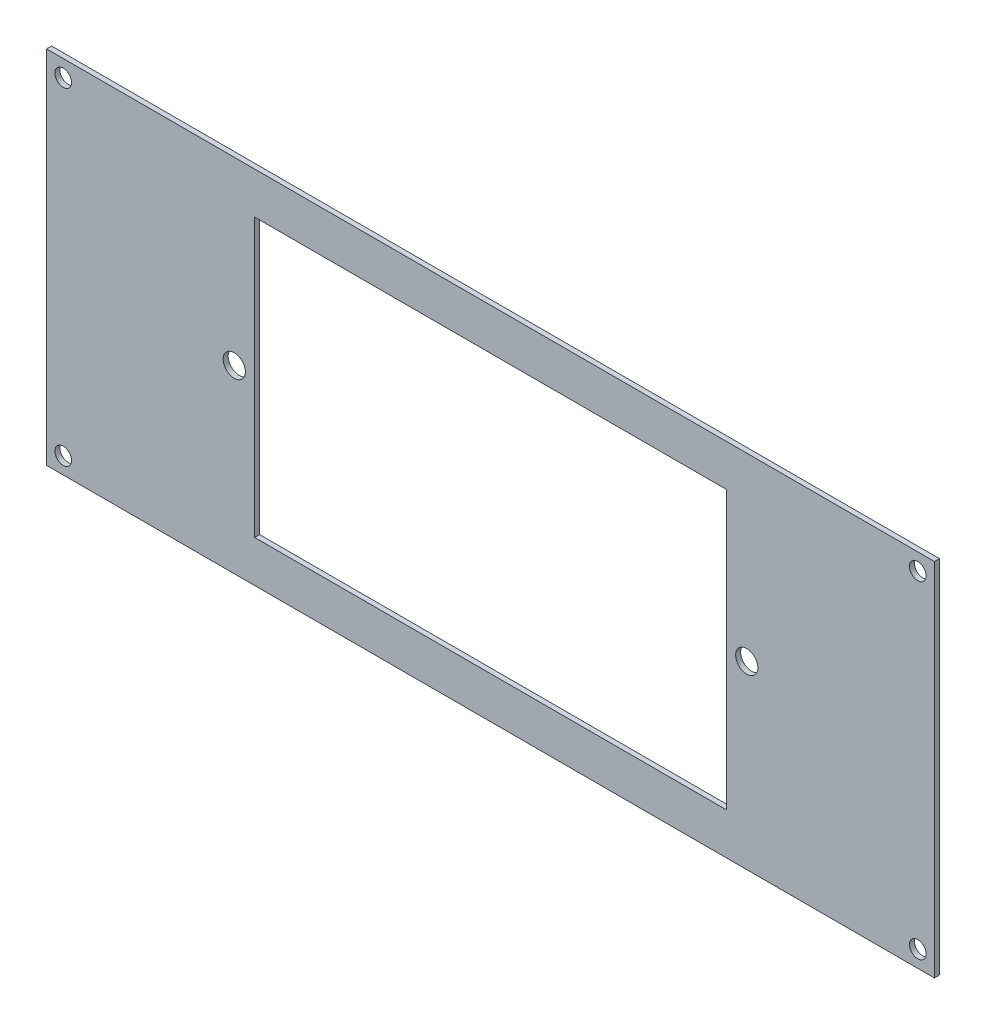
ISO-10303-21;
HEADER;
FILE_DESCRIPTION(('STEP AP214'),'2;1');
FILE_NAME('part.step','',(''),(''),'','','');
FILE_SCHEMA(('AUTOMOTIVE_DESIGN { 1 0 10303 214 1 1 1 1 }'));
ENDSEC;
DATA;
#1=APPLICATION_CONTEXT('core data for automotive mechanical design processes');
#2=APPLICATION_PROTOCOL_DEFINITION('international standard','automotive_design',2000,#1);
#3=PRODUCT_CONTEXT('',#1,'mechanical');
#4=PRODUCT('Part','Part','',(#3));
#5=PRODUCT_RELATED_PRODUCT_CATEGORY('part','',(#4));
#6=PRODUCT_DEFINITION_FORMATION('','',#4);
#7=PRODUCT_DEFINITION_CONTEXT('part definition',#1,'design');
#8=PRODUCT_DEFINITION('design','',#6,#7);
#9=PRODUCT_DEFINITION_SHAPE('','',#8);
#10=(LENGTH_UNIT() NAMED_UNIT(*) SI_UNIT(.MILLI.,.METRE.));
#11=(NAMED_UNIT(*) PLANE_ANGLE_UNIT() SI_UNIT($,.RADIAN.));
#12=(NAMED_UNIT(*) SI_UNIT($,.STERADIAN.) SOLID_ANGLE_UNIT());
#13=UNCERTAINTY_MEASURE_WITH_UNIT(LENGTH_MEASURE(1.E-05),#10,'distance_accuracy_value','');
#14=(GEOMETRIC_REPRESENTATION_CONTEXT(3) GLOBAL_UNCERTAINTY_ASSIGNED_CONTEXT((#13)) GLOBAL_UNIT_ASSIGNED_CONTEXT((#10,
#11,#12)) REPRESENTATION_CONTEXT('',''));
#15=CARTESIAN_POINT('',(0.,0.,0.));
#16=DIRECTION('',(0.,0.,1.));
#17=DIRECTION('',(1.,0.,0.));
#18=AXIS2_PLACEMENT_3D('',#15,#16,#17);
#19=CARTESIAN_POINT('',(0.,0.,0.9));
#20=DIRECTION('',(0.,0.,-1.));
#21=DIRECTION('',(-1.,0.,0.));
#22=AXIS2_PLACEMENT_3D('',#19,#20,#21);
#23=PLANE('',#22);
#24=CARTESIAN_POINT('',(33.825,32.5,0.9));
#25=DIRECTION('',(0.,0.,1.));
#26=DIRECTION('',(1.,0.,0.));
#27=AXIS2_PLACEMENT_3D('',#24,#25,#26);
#28=CIRCLE('',#27,2.);
#29=CARTESIAN_POINT('',(35.825,32.5,0.9));
#30=VERTEX_POINT('',#29);
#31=EDGE_CURVE('E128',#30,#30,#28,.T.);
#32=ORIENTED_EDGE('',*,*,#31,.F.);
#33=EDGE_LOOP('',(#32));
#34=FACE_BOUND('',#33,.T.);
#35=CARTESIAN_POINT('',(126.175,32.5,0.9));
#36=DIRECTION('',(0.,0.,1.));
#37=DIRECTION('',(1.,0.,0.));
#38=AXIS2_PLACEMENT_3D('',#35,#36,#37);
#39=CIRCLE('',#38,2.);
#40=CARTESIAN_POINT('',(128.175,32.5,0.9));
#41=VERTEX_POINT('',#40);
#42=EDGE_CURVE('E279',#41,#41,#39,.T.);
#43=ORIENTED_EDGE('',*,*,#42,.F.);
#44=EDGE_LOOP('',(#43));
#45=FACE_BOUND('',#44,.T.);
#46=CARTESIAN_POINT('',(157.,62.,0.9));
#47=DIRECTION('',(0.,0.,1.));
#48=DIRECTION('',(1.,0.,0.));
#49=AXIS2_PLACEMENT_3D('',#46,#47,#48);
#50=CIRCLE('',#49,1.5);
#51=CARTESIAN_POINT('',(158.5,62.,0.9));
#52=VERTEX_POINT('',#51);
#53=EDGE_CURVE('E138',#52,#52,#50,.T.);
#54=ORIENTED_EDGE('',*,*,#53,.F.);
#55=EDGE_LOOP('',(#54));
#56=FACE_BOUND('',#55,.T.);
#57=CARTESIAN_POINT('',(157.,3.,0.9));
#58=DIRECTION('',(0.,0.,1.));
#59=DIRECTION('',(1.,0.,0.));
#60=AXIS2_PLACEMENT_3D('',#57,#58,#59);
#61=CIRCLE('',#60,1.5);
#62=CARTESIAN_POINT('',(158.5,3.,0.9));
#63=VERTEX_POINT('',#62);
#64=EDGE_CURVE('E144',#63,#63,#61,.T.);
#65=ORIENTED_EDGE('',*,*,#64,.F.);
#66=EDGE_LOOP('',(#65));
#67=FACE_BOUND('',#66,.T.);
#68=CARTESIAN_POINT('',(3.,3.,0.9));
#69=DIRECTION('',(0.,0.,1.));
#70=DIRECTION('',(1.,0.,0.));
#71=AXIS2_PLACEMENT_3D('',#68,#69,#70);
#72=CIRCLE('',#71,1.5);
#73=CARTESIAN_POINT('',(4.5,3.,0.9));
#74=VERTEX_POINT('',#73);
#75=EDGE_CURVE('E150',#74,#74,#72,.T.);
#76=ORIENTED_EDGE('',*,*,#75,.F.);
#77=EDGE_LOOP('',(#76));
#78=FACE_BOUND('',#77,.T.);
#79=CARTESIAN_POINT('',(3.,62.,0.9));
#80=DIRECTION('',(0.,0.,1.));
#81=DIRECTION('',(1.,0.,0.));
#82=AXIS2_PLACEMENT_3D('',#79,#80,#81);
#83=CIRCLE('',#82,1.5);
#84=CARTESIAN_POINT('',(4.5,62.,0.9));
#85=VERTEX_POINT('',#84);
#86=EDGE_CURVE('E156',#85,#85,#83,.T.);
#87=ORIENTED_EDGE('',*,*,#86,.F.);
#88=EDGE_LOOP('',(#87));
#89=FACE_BOUND('',#88,.T.);
#90=DIRECTION('',(0.,-1.,0.));
#91=VECTOR('',#90,1.);
#92=CARTESIAN_POINT('',(0.,0.,0.9));
#93=LINE('',#92,#91);
#94=CARTESIAN_POINT('',(0.,65.,0.9));
#95=VERTEX_POINT('',#94);
#96=CARTESIAN_POINT('',(0.,0.,0.9));
#97=VERTEX_POINT('',#96);
#98=EDGE_CURVE('E162',#95,#97,#93,.T.);
#99=ORIENTED_EDGE('',*,*,#98,.T.);
#100=DIRECTION('',(1.,0.,0.));
#101=VECTOR('',#100,1.);
#102=CARTESIAN_POINT('',(0.,0.,0.9));
#103=LINE('',#102,#101);
#104=CARTESIAN_POINT('',(160.,0.,0.9));
#105=VERTEX_POINT('',#104);
#106=EDGE_CURVE('E165',#97,#105,#103,.T.);
#107=ORIENTED_EDGE('',*,*,#106,.T.);
#108=DIRECTION('',(0.,1.,0.));
#109=VECTOR('',#108,1.);
#110=CARTESIAN_POINT('',(160.,0.,0.9));
#111=LINE('',#110,#109);
#112=CARTESIAN_POINT('',(160.,65.,0.9));
#113=VERTEX_POINT('',#112);
#114=EDGE_CURVE('E168',#105,#113,#111,.T.);
#115=ORIENTED_EDGE('',*,*,#114,.T.);
#116=DIRECTION('',(-1.,0.,0.));
#117=VECTOR('',#116,1.);
#118=CARTESIAN_POINT('',(0.,65.,0.9));
#119=LINE('',#118,#117);
#120=EDGE_CURVE('E170',#113,#95,#119,.T.);
#121=ORIENTED_EDGE('',*,*,#120,.T.);
#122=EDGE_LOOP('',(#99,#107,#115,#121));
#123=FACE_BOUND('',#122,.T.);
#124=DIRECTION('',(0.,-1.,0.));
#125=VECTOR('',#124,1.);
#126=CARTESIAN_POINT('',(122.5,0.,0.9));
#127=LINE('',#126,#125);
#128=CARTESIAN_POINT('',(122.5,57.5,0.9));
#129=VERTEX_POINT('',#128);
#130=CARTESIAN_POINT('',(122.5,7.5,0.9));
#131=VERTEX_POINT('',#130);
#132=EDGE_CURVE('E48',#129,#131,#127,.T.);
#133=ORIENTED_EDGE('',*,*,#132,.T.);
#134=DIRECTION('',(1.,0.,0.));
#135=VECTOR('',#134,1.);
#136=CARTESIAN_POINT('',(0.,7.5,0.9));
#137=LINE('',#136,#135);
#138=CARTESIAN_POINT('',(37.5,7.5,0.9));
#139=VERTEX_POINT('',#138);
#140=EDGE_CURVE('E115',#139,#131,#137,.T.);
#141=ORIENTED_EDGE('',*,*,#140,.F.);
#142=DIRECTION('',(0.,-1.,0.));
#143=VECTOR('',#142,1.);
#144=CARTESIAN_POINT('',(37.5,0.,0.9));
#145=LINE('',#144,#143);
#146=CARTESIAN_POINT('',(37.5,57.5,0.9));
#147=VERTEX_POINT('',#146);
#148=EDGE_CURVE('E118',#147,#139,#145,.T.);
#149=ORIENTED_EDGE('',*,*,#148,.F.);
#150=DIRECTION('',(1.,0.,0.));
#151=VECTOR('',#150,1.);
#152=CARTESIAN_POINT('',(0.,57.5,0.9));
#153=LINE('',#152,#151);
#154=EDGE_CURVE('E127',#147,#129,#153,.T.);
#155=ORIENTED_EDGE('',*,*,#154,.T.);
#156=EDGE_LOOP('',(#133,#141,#149,#155));
#157=FACE_BOUND('',#156,.T.);
#158=ADVANCED_FACE('F33',(#34,#45,#56,#67,#78,#89,#123,#157),#23,.F.);
#159=CARTESIAN_POINT('',(0.,0.,0.));
#160=DIRECTION('',(0.,0.,-1.));
#161=DIRECTION('',(-1.,0.,0.));
#162=AXIS2_PLACEMENT_3D('',#159,#160,#161);
#163=PLANE('',#162);
#164=CARTESIAN_POINT('',(33.825,32.5,0.));
#165=DIRECTION('',(0.,0.,1.));
#166=DIRECTION('',(1.,0.,0.));
#167=AXIS2_PLACEMENT_3D('',#164,#165,#166);
#168=CIRCLE('',#167,2.);
#169=CARTESIAN_POINT('',(35.825,32.5,0.));
#170=VERTEX_POINT('',#169);
#171=EDGE_CURVE('E276',#170,#170,#168,.T.);
#172=ORIENTED_EDGE('',*,*,#171,.T.);
#173=EDGE_LOOP('',(#172));
#174=FACE_BOUND('',#173,.T.);
#175=CARTESIAN_POINT('',(126.175,32.5,0.));
#176=DIRECTION('',(0.,0.,1.));
#177=DIRECTION('',(1.,0.,0.));
#178=AXIS2_PLACEMENT_3D('',#175,#176,#177);
#179=CIRCLE('',#178,2.);
#180=CARTESIAN_POINT('',(128.175,32.5,0.));
#181=VERTEX_POINT('',#180);
#182=EDGE_CURVE('E121',#181,#181,#179,.T.);
#183=ORIENTED_EDGE('',*,*,#182,.T.);
#184=EDGE_LOOP('',(#183));
#185=FACE_BOUND('',#184,.T.);
#186=CARTESIAN_POINT('',(157.,3.,0.));
#187=DIRECTION('',(0.,0.,1.));
#188=DIRECTION('',(1.,0.,0.));
#189=AXIS2_PLACEMENT_3D('',#186,#187,#188);
#190=CIRCLE('',#189,1.5);
#191=CARTESIAN_POINT('',(158.5,3.,0.));
#192=VERTEX_POINT('',#191);
#193=EDGE_CURVE('E141',#192,#192,#190,.T.);
#194=ORIENTED_EDGE('',*,*,#193,.T.);
#195=EDGE_LOOP('',(#194));
#196=FACE_BOUND('',#195,.T.);
#197=CARTESIAN_POINT('',(3.,62.,0.));
#198=DIRECTION('',(0.,0.,1.));
#199=DIRECTION('',(1.,0.,0.));
#200=AXIS2_PLACEMENT_3D('',#197,#198,#199);
#201=CIRCLE('',#200,1.5);
#202=CARTESIAN_POINT('',(4.5,62.,0.));
#203=VERTEX_POINT('',#202);
#204=EDGE_CURVE('E153',#203,#203,#201,.T.);
#205=ORIENTED_EDGE('',*,*,#204,.T.);
#206=EDGE_LOOP('',(#205));
#207=FACE_BOUND('',#206,.T.);
#208=DIRECTION('',(0.,-1.,0.));
#209=VECTOR('',#208,1.);
#210=CARTESIAN_POINT('',(0.,0.,0.));
#211=LINE('',#210,#209);
#212=CARTESIAN_POINT('',(0.,65.,0.));
#213=VERTEX_POINT('',#212);
#214=CARTESIAN_POINT('',(0.,0.,0.));
#215=VERTEX_POINT('',#214);
#216=EDGE_CURVE('E159',#213,#215,#211,.T.);
#217=ORIENTED_EDGE('',*,*,#216,.F.);
#218=DIRECTION('',(-1.,0.,0.));
#219=VECTOR('',#218,1.);
#220=CARTESIAN_POINT('',(0.,65.,0.));
#221=LINE('',#220,#219);
#222=CARTESIAN_POINT('',(160.,65.,0.));
#223=VERTEX_POINT('',#222);
#224=EDGE_CURVE('E166',#223,#213,#221,.T.);
#225=ORIENTED_EDGE('',*,*,#224,.F.);
#226=DIRECTION('',(0.,1.,0.));
#227=VECTOR('',#226,1.);
#228=CARTESIAN_POINT('',(160.,0.,0.));
#229=LINE('',#228,#227);
#230=CARTESIAN_POINT('',(160.,0.,0.));
#231=VERTEX_POINT('',#230);
#232=EDGE_CURVE('E177',#231,#223,#229,.T.);
#233=ORIENTED_EDGE('',*,*,#232,.F.);
#234=DIRECTION('',(1.,0.,0.));
#235=VECTOR('',#234,1.);
#236=CARTESIAN_POINT('',(0.,0.,0.));
#237=LINE('',#236,#235);
#238=EDGE_CURVE('E175',#215,#231,#237,.T.);
#239=ORIENTED_EDGE('',*,*,#238,.F.);
#240=EDGE_LOOP('',(#217,#225,#233,#239));
#241=FACE_BOUND('',#240,.T.);
#242=CARTESIAN_POINT('',(3.,3.,0.));
#243=DIRECTION('',(0.,0.,1.));
#244=DIRECTION('',(1.,0.,0.));
#245=AXIS2_PLACEMENT_3D('',#242,#243,#244);
#246=CIRCLE('',#245,1.5);
#247=CARTESIAN_POINT('',(4.5,3.,0.));
#248=VERTEX_POINT('',#247);
#249=EDGE_CURVE('E147',#248,#248,#246,.T.);
#250=ORIENTED_EDGE('',*,*,#249,.T.);
#251=EDGE_LOOP('',(#250));
#252=FACE_BOUND('',#251,.T.);
#253=CARTESIAN_POINT('',(157.,62.,0.));
#254=DIRECTION('',(0.,0.,1.));
#255=DIRECTION('',(1.,0.,0.));
#256=AXIS2_PLACEMENT_3D('',#253,#254,#255);
#257=CIRCLE('',#256,1.5);
#258=CARTESIAN_POINT('',(158.5,62.,0.));
#259=VERTEX_POINT('',#258);
#260=EDGE_CURVE('E134',#259,#259,#257,.T.);
#261=ORIENTED_EDGE('',*,*,#260,.T.);
#262=EDGE_LOOP('',(#261));
#263=FACE_BOUND('',#262,.T.);
#264=DIRECTION('',(1.,0.,0.));
#265=VECTOR('',#264,1.);
#266=CARTESIAN_POINT('',(0.,7.5,0.));
#267=LINE('',#266,#265);
#268=CARTESIAN_POINT('',(37.5,7.5,0.));
#269=VERTEX_POINT('',#268);
#270=CARTESIAN_POINT('',(122.5,7.5,0.));
#271=VERTEX_POINT('',#270);
#272=EDGE_CURVE('E110',#269,#271,#267,.T.);
#273=ORIENTED_EDGE('',*,*,#272,.T.);
#274=DIRECTION('',(0.,-1.,0.));
#275=VECTOR('',#274,1.);
#276=CARTESIAN_POINT('',(122.5,0.,0.));
#277=LINE('',#276,#275);
#278=CARTESIAN_POINT('',(122.5,57.5,0.));
#279=VERTEX_POINT('',#278);
#280=EDGE_CURVE('E106',#279,#271,#277,.T.);
#281=ORIENTED_EDGE('',*,*,#280,.F.);
#282=DIRECTION('',(1.,0.,0.));
#283=VECTOR('',#282,1.);
#284=CARTESIAN_POINT('',(0.,57.5,0.));
#285=LINE('',#284,#283);
#286=CARTESIAN_POINT('',(37.5,57.5,0.));
#287=VERTEX_POINT('',#286);
#288=EDGE_CURVE('E98',#287,#279,#285,.T.);
#289=ORIENTED_EDGE('',*,*,#288,.F.);
#290=DIRECTION('',(0.,-1.,0.));
#291=VECTOR('',#290,1.);
#292=CARTESIAN_POINT('',(37.5,0.,0.));
#293=LINE('',#292,#291);
#294=EDGE_CURVE('E56',#287,#269,#293,.T.);
#295=ORIENTED_EDGE('',*,*,#294,.T.);
#296=EDGE_LOOP('',(#273,#281,#289,#295));
#297=FACE_BOUND('',#296,.T.);
#298=ADVANCED_FACE('F113',(#174,#185,#196,#207,#241,#252,#263,#297),#163,.T.);
#299=CARTESIAN_POINT('',(0.,0.,0.9));
#300=DIRECTION('',(1.,0.,0.));
#301=DIRECTION('',(0.,0.,-1.));
#302=AXIS2_PLACEMENT_3D('',#299,#300,#301);
#303=PLANE('',#302);
#304=ORIENTED_EDGE('',*,*,#216,.T.);
#305=DIRECTION('',(0.,0.,-1.));
#306=VECTOR('',#305,1.);
#307=CARTESIAN_POINT('',(0.,0.,0.9));
#308=LINE('',#307,#306);
#309=EDGE_CURVE('E11',#97,#215,#308,.T.);
#310=ORIENTED_EDGE('',*,*,#309,.F.);
#311=ORIENTED_EDGE('',*,*,#98,.F.);
#312=DIRECTION('',(0.,0.,-1.));
#313=VECTOR('',#312,1.);
#314=CARTESIAN_POINT('',(0.,65.,0.9));
#315=LINE('',#314,#313);
#316=EDGE_CURVE('E172',#95,#213,#315,.T.);
#317=ORIENTED_EDGE('',*,*,#316,.T.);
#318=EDGE_LOOP('',(#304,#310,#311,#317));
#319=FACE_BOUND('',#318,.T.);
#320=ADVANCED_FACE('F35',(#319),#303,.F.);
#321=CARTESIAN_POINT('',(0.,0.,0.9));
#322=DIRECTION('',(0.,1.,0.));
#323=DIRECTION('',(0.,0.,1.));
#324=AXIS2_PLACEMENT_3D('',#321,#322,#323);
#325=PLANE('',#324);
#326=ORIENTED_EDGE('',*,*,#238,.T.);
#327=DIRECTION('',(0.,0.,-1.));
#328=VECTOR('',#327,1.);
#329=CARTESIAN_POINT('',(160.,0.,0.9));
#330=LINE('',#329,#328);
#331=EDGE_CURVE('E41',#105,#231,#330,.T.);
#332=ORIENTED_EDGE('',*,*,#331,.F.);
#333=ORIENTED_EDGE('',*,*,#106,.F.);
#334=ORIENTED_EDGE('',*,*,#309,.T.);
#335=EDGE_LOOP('',(#326,#332,#333,#334));
#336=FACE_BOUND('',#335,.T.);
#337=ADVANCED_FACE('F205',(#336),#325,.F.);
#338=CARTESIAN_POINT('',(160.,0.,0.9));
#339=DIRECTION('',(-1.,0.,0.));
#340=DIRECTION('',(0.,0.,1.));
#341=AXIS2_PLACEMENT_3D('',#338,#339,#340);
#342=PLANE('',#341);
#343=ORIENTED_EDGE('',*,*,#232,.T.);
#344=DIRECTION('',(0.,0.,-1.));
#345=VECTOR('',#344,1.);
#346=CARTESIAN_POINT('',(160.,65.,0.9));
#347=LINE('',#346,#345);
#348=EDGE_CURVE('E182',#113,#223,#347,.T.);
#349=ORIENTED_EDGE('',*,*,#348,.F.);
#350=ORIENTED_EDGE('',*,*,#114,.F.);
#351=ORIENTED_EDGE('',*,*,#331,.T.);
#352=EDGE_LOOP('',(#343,#349,#350,#351));
#353=FACE_BOUND('',#352,.T.);
#354=ADVANCED_FACE('F189',(#353),#342,.F.);
#355=CARTESIAN_POINT('',(0.,65.,0.9));
#356=DIRECTION('',(0.,-1.,0.));
#357=DIRECTION('',(0.,0.,-1.));
#358=AXIS2_PLACEMENT_3D('',#355,#356,#357);
#359=PLANE('',#358);
#360=ORIENTED_EDGE('',*,*,#224,.T.);
#361=ORIENTED_EDGE('',*,*,#316,.F.);
#362=ORIENTED_EDGE('',*,*,#120,.F.);
#363=ORIENTED_EDGE('',*,*,#348,.T.);
#364=EDGE_LOOP('',(#360,#361,#362,#363));
#365=FACE_BOUND('',#364,.T.);
#366=ADVANCED_FACE('F198',(#365),#359,.F.);
#367=CARTESIAN_POINT('',(3.,62.,0.9));
#368=DIRECTION('',(0.,0.,-1.));
#369=DIRECTION('',(-1.,0.,0.));
#370=AXIS2_PLACEMENT_3D('',#367,#368,#369);
#371=CYLINDRICAL_SURFACE('',#370,1.5);
#372=ORIENTED_EDGE('',*,*,#86,.T.);
#373=EDGE_LOOP('',(#372));
#374=FACE_BOUND('',#373,.T.);
#375=ORIENTED_EDGE('',*,*,#204,.F.);
#376=EDGE_LOOP('',(#375));
#377=FACE_BOUND('',#376,.T.);
#378=ADVANCED_FACE('F223',(#374,#377),#371,.F.);
#379=CARTESIAN_POINT('',(3.,3.,0.9));
#380=DIRECTION('',(0.,0.,-1.));
#381=DIRECTION('',(-1.,0.,0.));
#382=AXIS2_PLACEMENT_3D('',#379,#380,#381);
#383=CYLINDRICAL_SURFACE('',#382,1.5);
#384=ORIENTED_EDGE('',*,*,#75,.T.);
#385=EDGE_LOOP('',(#384));
#386=FACE_BOUND('',#385,.T.);
#387=ORIENTED_EDGE('',*,*,#249,.F.);
#388=EDGE_LOOP('',(#387));
#389=FACE_BOUND('',#388,.T.);
#390=ADVANCED_FACE('F230',(#386,#389),#383,.F.);
#391=CARTESIAN_POINT('',(157.,3.,0.9));
#392=DIRECTION('',(0.,0.,-1.));
#393=DIRECTION('',(-1.,0.,0.));
#394=AXIS2_PLACEMENT_3D('',#391,#392,#393);
#395=CYLINDRICAL_SURFACE('',#394,1.5);
#396=ORIENTED_EDGE('',*,*,#64,.T.);
#397=EDGE_LOOP('',(#396));
#398=FACE_BOUND('',#397,.T.);
#399=ORIENTED_EDGE('',*,*,#193,.F.);
#400=EDGE_LOOP('',(#399));
#401=FACE_BOUND('',#400,.T.);
#402=ADVANCED_FACE('F235',(#398,#401),#395,.F.);
#403=CARTESIAN_POINT('',(157.,62.,0.9));
#404=DIRECTION('',(0.,0.,-1.));
#405=DIRECTION('',(-1.,0.,0.));
#406=AXIS2_PLACEMENT_3D('',#403,#404,#405);
#407=CYLINDRICAL_SURFACE('',#406,1.5);
#408=ORIENTED_EDGE('',*,*,#53,.T.);
#409=EDGE_LOOP('',(#408));
#410=FACE_BOUND('',#409,.T.);
#411=ORIENTED_EDGE('',*,*,#260,.F.);
#412=EDGE_LOOP('',(#411));
#413=FACE_BOUND('',#412,.T.);
#414=ADVANCED_FACE('F245',(#410,#413),#407,.F.);
#415=CARTESIAN_POINT('',(122.5,0.,0.));
#416=DIRECTION('',(-1.,0.,0.));
#417=DIRECTION('',(0.,0.,1.));
#418=AXIS2_PLACEMENT_3D('',#415,#416,#417);
#419=PLANE('',#418);
#420=ORIENTED_EDGE('',*,*,#132,.F.);
#421=DIRECTION('',(0.,0.,1.));
#422=VECTOR('',#421,1.);
#423=CARTESIAN_POINT('',(122.5,57.5,0.));
#424=LINE('',#423,#422);
#425=EDGE_CURVE('E101',#279,#129,#424,.T.);
#426=ORIENTED_EDGE('',*,*,#425,.F.);
#427=ORIENTED_EDGE('',*,*,#280,.T.);
#428=DIRECTION('',(0.,0.,1.));
#429=VECTOR('',#428,1.);
#430=CARTESIAN_POINT('',(122.5,7.5,0.));
#431=LINE('',#430,#429);
#432=EDGE_CURVE('E132',#271,#131,#431,.T.);
#433=ORIENTED_EDGE('',*,*,#432,.T.);
#434=EDGE_LOOP('',(#420,#426,#427,#433));
#435=FACE_BOUND('',#434,.T.);
#436=ADVANCED_FACE('F108',(#435),#419,.T.);
#437=CARTESIAN_POINT('',(0.,7.5,0.));
#438=DIRECTION('',(0.,-1.,0.));
#439=DIRECTION('',(0.,0.,-1.));
#440=AXIS2_PLACEMENT_3D('',#437,#438,#439);
#441=PLANE('',#440);
#442=ORIENTED_EDGE('',*,*,#140,.T.);
#443=ORIENTED_EDGE('',*,*,#432,.F.);
#444=ORIENTED_EDGE('',*,*,#272,.F.);
#445=DIRECTION('',(0.,0.,1.));
#446=VECTOR('',#445,1.);
#447=CARTESIAN_POINT('',(37.5,7.5,0.));
#448=LINE('',#447,#446);
#449=EDGE_CURVE('E135',#269,#139,#448,.T.);
#450=ORIENTED_EDGE('',*,*,#449,.T.);
#451=EDGE_LOOP('',(#442,#443,#444,#450));
#452=FACE_BOUND('',#451,.T.);
#453=ADVANCED_FACE('F255',(#452),#441,.F.);
#454=CARTESIAN_POINT('',(37.5,0.,0.));
#455=DIRECTION('',(-1.,0.,0.));
#456=DIRECTION('',(0.,0.,1.));
#457=AXIS2_PLACEMENT_3D('',#454,#455,#456);
#458=PLANE('',#457);
#459=ORIENTED_EDGE('',*,*,#148,.T.);
#460=ORIENTED_EDGE('',*,*,#449,.F.);
#461=ORIENTED_EDGE('',*,*,#294,.F.);
#462=DIRECTION('',(0.,0.,1.));
#463=VECTOR('',#462,1.);
#464=CARTESIAN_POINT('',(37.5,57.5,0.));
#465=LINE('',#464,#463);
#466=EDGE_CURVE('E103',#287,#147,#465,.T.);
#467=ORIENTED_EDGE('',*,*,#466,.T.);
#468=EDGE_LOOP('',(#459,#460,#461,#467));
#469=FACE_BOUND('',#468,.T.);
#470=ADVANCED_FACE('F259',(#469),#458,.F.);
#471=CARTESIAN_POINT('',(0.,57.5,0.));
#472=DIRECTION('',(0.,-1.,0.));
#473=DIRECTION('',(0.,0.,-1.));
#474=AXIS2_PLACEMENT_3D('',#471,#472,#473);
#475=PLANE('',#474);
#476=ORIENTED_EDGE('',*,*,#154,.F.);
#477=ORIENTED_EDGE('',*,*,#466,.F.);
#478=ORIENTED_EDGE('',*,*,#288,.T.);
#479=ORIENTED_EDGE('',*,*,#425,.T.);
#480=EDGE_LOOP('',(#476,#477,#478,#479));
#481=FACE_BOUND('',#480,.T.);
#482=ADVANCED_FACE('F100',(#481),#475,.T.);
#483=CARTESIAN_POINT('',(126.175,32.5,0.));
#484=DIRECTION('',(0.,0.,1.));
#485=DIRECTION('',(1.,0.,0.));
#486=AXIS2_PLACEMENT_3D('',#483,#484,#485);
#487=CYLINDRICAL_SURFACE('',#486,2.);
#488=ORIENTED_EDGE('',*,*,#182,.F.);
#489=EDGE_LOOP('',(#488));
#490=FACE_BOUND('',#489,.T.);
#491=ORIENTED_EDGE('',*,*,#42,.T.);
#492=EDGE_LOOP('',(#491));
#493=FACE_BOUND('',#492,.T.);
#494=ADVANCED_FACE('F258',(#490,#493),#487,.F.);
#495=CARTESIAN_POINT('',(33.825,32.5,0.));
#496=DIRECTION('',(0.,0.,1.));
#497=DIRECTION('',(1.,0.,0.));
#498=AXIS2_PLACEMENT_3D('',#495,#496,#497);
#499=CYLINDRICAL_SURFACE('',#498,2.);
#500=ORIENTED_EDGE('',*,*,#171,.F.);
#501=EDGE_LOOP('',(#500));
#502=FACE_BOUND('',#501,.T.);
#503=ORIENTED_EDGE('',*,*,#31,.T.);
#504=EDGE_LOOP('',(#503));
#505=FACE_BOUND('',#504,.T.);
#506=ADVANCED_FACE('F267',(#502,#505),#499,.F.);
#507=CLOSED_SHELL('',(#158,#298,#320,#337,#354,#366,#378,#390,#402,#414,#436,#453,#470,#482,
#494,#506));
#508=MANIFOLD_SOLID_BREP('B2',#507);
#509=ADVANCED_BREP_SHAPE_REPRESENTATION('',(#18,#508),#14);
#510=SHAPE_DEFINITION_REPRESENTATION(#9,#509);
ENDSEC;
END-ISO-10303-21;
